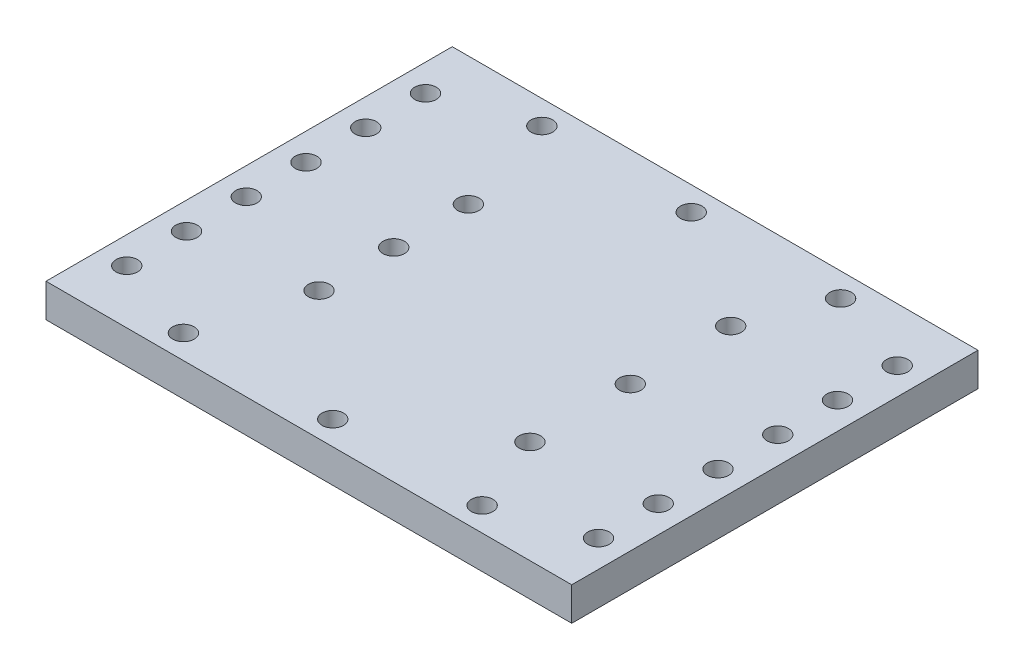
ISO-10303-21;
HEADER;
FILE_DESCRIPTION(('STEP AP214'),'2;1');
FILE_NAME('part.step','',(''),(''),'','','');
FILE_SCHEMA(('AUTOMOTIVE_DESIGN { 1 0 10303 214 1 1 1 1 }'));
ENDSEC;
DATA;
#1=APPLICATION_CONTEXT('core data for automotive mechanical design processes');
#2=APPLICATION_PROTOCOL_DEFINITION('international standard','automotive_design',2000,#1);
#3=PRODUCT_CONTEXT('',#1,'mechanical');
#4=PRODUCT('Part','Part','',(#3));
#5=PRODUCT_RELATED_PRODUCT_CATEGORY('part','',(#4));
#6=PRODUCT_DEFINITION_FORMATION('','',#4);
#7=PRODUCT_DEFINITION_CONTEXT('part definition',#1,'design');
#8=PRODUCT_DEFINITION('design','',#6,#7);
#9=PRODUCT_DEFINITION_SHAPE('','',#8);
#10=(LENGTH_UNIT() NAMED_UNIT(*) SI_UNIT(.MILLI.,.METRE.));
#11=(NAMED_UNIT(*) PLANE_ANGLE_UNIT() SI_UNIT($,.RADIAN.));
#12=(NAMED_UNIT(*) SI_UNIT($,.STERADIAN.) SOLID_ANGLE_UNIT());
#13=UNCERTAINTY_MEASURE_WITH_UNIT(LENGTH_MEASURE(1.E-05),#10,'distance_accuracy_value','');
#14=(GEOMETRIC_REPRESENTATION_CONTEXT(3) GLOBAL_UNCERTAINTY_ASSIGNED_CONTEXT((#13)) GLOBAL_UNIT_ASSIGNED_CONTEXT((#10,
#11,#12)) REPRESENTATION_CONTEXT('',''));
#15=CARTESIAN_POINT('',(0.,0.,0.));
#16=DIRECTION('',(0.,0.,1.));
#17=DIRECTION('',(1.,0.,0.));
#18=AXIS2_PLACEMENT_3D('',#15,#16,#17);
#19=CARTESIAN_POINT('',(-87.165773612082,5.588,-33.4500324441074));
#20=DIRECTION('',(1.,0.,0.));
#21=DIRECTION('',(0.,0.,-1.));
#22=AXIS2_PLACEMENT_3D('',#19,#20,#21);
#23=PLANE('',#22);
#24=DIRECTION('',(0.,0.,1.));
#25=VECTOR('',#24,1.);
#26=CARTESIAN_POINT('',(-87.165773612082,0.,-33.4500324441074));
#27=LINE('',#26,#25);
#28=CARTESIAN_POINT('',(-87.165773612082,0.,-33.4500324441074));
#29=VERTEX_POINT('',#28);
#30=CARTESIAN_POINT('',(-87.165773612082,0.,34.5499675558926));
#31=VERTEX_POINT('',#30);
#32=EDGE_CURVE('E96',#29,#31,#27,.T.);
#33=ORIENTED_EDGE('',*,*,#32,.T.);
#34=DIRECTION('',(0.,-1.,0.));
#35=VECTOR('',#34,1.);
#36=CARTESIAN_POINT('',(-87.165773612082,5.588,34.5499675558926));
#37=LINE('',#36,#35);
#38=CARTESIAN_POINT('',(-87.165773612082,5.588,34.5499675558926));
#39=VERTEX_POINT('',#38);
#40=EDGE_CURVE('E11',#39,#31,#37,.T.);
#41=ORIENTED_EDGE('',*,*,#40,.F.);
#42=DIRECTION('',(0.,0.,1.));
#43=VECTOR('',#42,1.);
#44=CARTESIAN_POINT('',(-87.165773612082,5.588,-33.4500324441074));
#45=LINE('',#44,#43);
#46=CARTESIAN_POINT('',(-87.165773612082,5.588,-33.4500324441074));
#47=VERTEX_POINT('',#46);
#48=EDGE_CURVE('E84',#47,#39,#45,.T.);
#49=ORIENTED_EDGE('',*,*,#48,.F.);
#50=DIRECTION('',(0.,-1.,0.));
#51=VECTOR('',#50,1.);
#52=CARTESIAN_POINT('',(-87.165773612082,5.588,-33.4500324441074));
#53=LINE('',#52,#51);
#54=EDGE_CURVE('E92',#47,#29,#53,.T.);
#55=ORIENTED_EDGE('',*,*,#54,.T.);
#56=EDGE_LOOP('',(#33,#41,#49,#55));
#57=FACE_BOUND('',#56,.T.);
#58=ADVANCED_FACE('F33',(#57),#23,.F.);
#59=CARTESIAN_POINT('',(-87.165773612082,5.588,34.5499675558926));
#60=DIRECTION('',(0.,0.,-1.));
#61=DIRECTION('',(-1.,0.,0.));
#62=AXIS2_PLACEMENT_3D('',#59,#60,#61);
#63=PLANE('',#62);
#64=DIRECTION('',(1.,0.,0.));
#65=VECTOR('',#64,1.);
#66=CARTESIAN_POINT('',(-87.165773612082,0.,34.5499675558926));
#67=LINE('',#66,#65);
#68=CARTESIAN_POINT('',(0.834226387917991,0.,34.5499675558926));
#69=VERTEX_POINT('',#68);
#70=EDGE_CURVE('E88',#31,#69,#67,.T.);
#71=ORIENTED_EDGE('',*,*,#70,.T.);
#72=DIRECTION('',(0.,-1.,0.));
#73=VECTOR('',#72,1.);
#74=CARTESIAN_POINT('',(0.834226387917991,5.588,34.5499675558926));
#75=LINE('',#74,#73);
#76=CARTESIAN_POINT('',(0.834226387917991,5.588,34.5499675558926));
#77=VERTEX_POINT('',#76);
#78=EDGE_CURVE('E41',#77,#69,#75,.T.);
#79=ORIENTED_EDGE('',*,*,#78,.F.);
#80=DIRECTION('',(1.,0.,0.));
#81=VECTOR('',#80,1.);
#82=CARTESIAN_POINT('',(-87.165773612082,5.588,34.5499675558926));
#83=LINE('',#82,#81);
#84=EDGE_CURVE('E79',#39,#77,#83,.T.);
#85=ORIENTED_EDGE('',*,*,#84,.F.);
#86=ORIENTED_EDGE('',*,*,#40,.T.);
#87=EDGE_LOOP('',(#71,#79,#85,#86));
#88=FACE_BOUND('',#87,.T.);
#89=ADVANCED_FACE('F87',(#88),#63,.F.);
#90=CARTESIAN_POINT('',(0.834226387917983,5.588,-33.4500324441074));
#91=DIRECTION('',(-1.,0.,0.));
#92=DIRECTION('',(0.,0.,1.));
#93=AXIS2_PLACEMENT_3D('',#90,#91,#92);
#94=PLANE('',#93);
#95=DIRECTION('',(0.,0.,-1.));
#96=VECTOR('',#95,1.);
#97=CARTESIAN_POINT('',(0.834226387917983,0.,-33.4500324441074));
#98=LINE('',#97,#96);
#99=CARTESIAN_POINT('',(0.834226387917983,0.,-33.4500324441074));
#100=VERTEX_POINT('',#99);
#101=EDGE_CURVE('E66',#69,#100,#98,.T.);
#102=ORIENTED_EDGE('',*,*,#101,.T.);
#103=DIRECTION('',(0.,-1.,0.));
#104=VECTOR('',#103,1.);
#105=CARTESIAN_POINT('',(0.834226387917983,5.588,-33.4500324441074));
#106=LINE('',#105,#104);
#107=CARTESIAN_POINT('',(0.834226387917983,5.588,-33.4500324441074));
#108=VERTEX_POINT('',#107);
#109=EDGE_CURVE('E89',#108,#100,#106,.T.);
#110=ORIENTED_EDGE('',*,*,#109,.F.);
#111=DIRECTION('',(0.,0.,-1.));
#112=VECTOR('',#111,1.);
#113=CARTESIAN_POINT('',(0.834226387917983,5.588,-33.4500324441074));
#114=LINE('',#113,#112);
#115=EDGE_CURVE('E82',#77,#108,#114,.T.);
#116=ORIENTED_EDGE('',*,*,#115,.F.);
#117=ORIENTED_EDGE('',*,*,#78,.T.);
#118=EDGE_LOOP('',(#102,#110,#116,#117));
#119=FACE_BOUND('',#118,.T.);
#120=ADVANCED_FACE('F90',(#119),#94,.F.);
#121=CARTESIAN_POINT('',(-87.165773612082,5.588,-33.4500324441074));
#122=DIRECTION('',(0.,0.,1.));
#123=DIRECTION('',(1.,0.,0.));
#124=AXIS2_PLACEMENT_3D('',#121,#122,#123);
#125=PLANE('',#124);
#126=DIRECTION('',(-1.,0.,0.));
#127=VECTOR('',#126,1.);
#128=CARTESIAN_POINT('',(-87.165773612082,0.,-33.4500324441074));
#129=LINE('',#128,#127);
#130=EDGE_CURVE('E72',#100,#29,#129,.T.);
#131=ORIENTED_EDGE('',*,*,#130,.T.);
#132=ORIENTED_EDGE('',*,*,#54,.F.);
#133=DIRECTION('',(-1.,0.,0.));
#134=VECTOR('',#133,1.);
#135=CARTESIAN_POINT('',(-87.165773612082,5.588,-33.4500324441074));
#136=LINE('',#135,#134);
#137=EDGE_CURVE('E49',#108,#47,#136,.T.);
#138=ORIENTED_EDGE('',*,*,#137,.F.);
#139=ORIENTED_EDGE('',*,*,#109,.T.);
#140=EDGE_LOOP('',(#131,#132,#138,#139));
#141=FACE_BOUND('',#140,.T.);
#142=ADVANCED_FACE('F104',(#141),#125,.F.);
#143=CARTESIAN_POINT('',(0.,5.588,0.));
#144=DIRECTION('',(0.,1.,0.));
#145=DIRECTION('',(0.,0.,1.));
#146=AXIS2_PLACEMENT_3D('',#143,#144,#145);
#147=PLANE('',#146);
#148=CARTESIAN_POINT('',(-3.68577361208203,5.588,25.5499675558926));
#149=DIRECTION('',(0.,1.,0.));
#150=DIRECTION('',(0.,0.,1.));
#151=AXIS2_PLACEMENT_3D('',#148,#149,#150);
#152=CIRCLE('',#151,1.8);
#153=CARTESIAN_POINT('',(-3.68577361208203,5.588,27.3499675558926));
#154=VERTEX_POINT('',#153);
#155=EDGE_CURVE('E248',#154,#154,#152,.T.);
#156=ORIENTED_EDGE('',*,*,#155,.F.);
#157=EDGE_LOOP('',(#156));
#158=FACE_BOUND('',#157,.T.);
#159=CARTESIAN_POINT('',(-82.645773612082,5.588,25.5499675558926));
#160=DIRECTION('',(0.,1.,0.));
#161=DIRECTION('',(0.,0.,1.));
#162=AXIS2_PLACEMENT_3D('',#159,#160,#161);
#163=CIRCLE('',#162,1.79999999999999);
#164=CARTESIAN_POINT('',(-82.645773612082,5.588,27.3499675558926));
#165=VERTEX_POINT('',#164);
#166=EDGE_CURVE('E242',#165,#165,#163,.T.);
#167=ORIENTED_EDGE('',*,*,#166,.F.);
#168=EDGE_LOOP('',(#167));
#169=FACE_BOUND('',#168,.T.);
#170=CARTESIAN_POINT('',(-3.68577361208203,5.588,15.5499675558926));
#171=DIRECTION('',(0.,1.,0.));
#172=DIRECTION('',(0.,0.,1.));
#173=AXIS2_PLACEMENT_3D('',#170,#171,#172);
#174=CIRCLE('',#173,1.8);
#175=CARTESIAN_POINT('',(-3.68577361208203,5.588,17.3499675558926));
#176=VERTEX_POINT('',#175);
#177=EDGE_CURVE('E236',#176,#176,#174,.T.);
#178=ORIENTED_EDGE('',*,*,#177,.F.);
#179=EDGE_LOOP('',(#178));
#180=FACE_BOUND('',#179,.T.);
#181=CARTESIAN_POINT('',(-82.645773612082,5.588,15.5499675558926));
#182=DIRECTION('',(0.,1.,0.));
#183=DIRECTION('',(0.,0.,1.));
#184=AXIS2_PLACEMENT_3D('',#181,#182,#183);
#185=CIRCLE('',#184,1.79999999999999);
#186=CARTESIAN_POINT('',(-82.645773612082,5.588,17.3499675558926));
#187=VERTEX_POINT('',#186);
#188=EDGE_CURVE('E230',#187,#187,#185,.T.);
#189=ORIENTED_EDGE('',*,*,#188,.F.);
#190=EDGE_LOOP('',(#189));
#191=FACE_BOUND('',#190,.T.);
#192=CARTESIAN_POINT('',(-3.68577361208203,5.588,5.54996755589264));
#193=DIRECTION('',(0.,1.,0.));
#194=DIRECTION('',(0.,0.,1.));
#195=AXIS2_PLACEMENT_3D('',#192,#193,#194);
#196=CIRCLE('',#195,1.8);
#197=CARTESIAN_POINT('',(-3.68577361208203,5.588,7.34996755589264));
#198=VERTEX_POINT('',#197);
#199=EDGE_CURVE('E224',#198,#198,#196,.T.);
#200=ORIENTED_EDGE('',*,*,#199,.F.);
#201=EDGE_LOOP('',(#200));
#202=FACE_BOUND('',#201,.T.);
#203=CARTESIAN_POINT('',(-82.645773612082,5.588,5.54996755589264));
#204=DIRECTION('',(0.,1.,0.));
#205=DIRECTION('',(0.,0.,1.));
#206=AXIS2_PLACEMENT_3D('',#203,#204,#205);
#207=CIRCLE('',#206,1.79999999999999);
#208=CARTESIAN_POINT('',(-82.645773612082,5.588,7.34996755589263));
#209=VERTEX_POINT('',#208);
#210=EDGE_CURVE('E218',#209,#209,#207,.T.);
#211=ORIENTED_EDGE('',*,*,#210,.F.);
#212=EDGE_LOOP('',(#211));
#213=FACE_BOUND('',#212,.T.);
#214=CARTESIAN_POINT('',(-3.68577361208203,5.588,-4.45003244410736));
#215=DIRECTION('',(0.,1.,0.));
#216=DIRECTION('',(0.,0.,1.));
#217=AXIS2_PLACEMENT_3D('',#214,#215,#216);
#218=CIRCLE('',#217,1.8);
#219=CARTESIAN_POINT('',(-3.68577361208203,5.588,-2.65003244410736));
#220=VERTEX_POINT('',#219);
#221=EDGE_CURVE('E212',#220,#220,#218,.T.);
#222=ORIENTED_EDGE('',*,*,#221,.F.);
#223=EDGE_LOOP('',(#222));
#224=FACE_BOUND('',#223,.T.);
#225=CARTESIAN_POINT('',(-82.645773612082,5.588,-4.45003244410736));
#226=DIRECTION('',(0.,1.,0.));
#227=DIRECTION('',(0.,0.,1.));
#228=AXIS2_PLACEMENT_3D('',#225,#226,#227);
#229=CIRCLE('',#228,1.79999999999999);
#230=CARTESIAN_POINT('',(-82.645773612082,5.588,-2.65003244410736));
#231=VERTEX_POINT('',#230);
#232=EDGE_CURVE('E206',#231,#231,#229,.T.);
#233=ORIENTED_EDGE('',*,*,#232,.F.);
#234=EDGE_LOOP('',(#233));
#235=FACE_BOUND('',#234,.T.);
#236=CARTESIAN_POINT('',(-3.68577361208202,5.588,-14.4500324441074));
#237=DIRECTION('',(0.,1.,0.));
#238=DIRECTION('',(0.,0.,1.));
#239=AXIS2_PLACEMENT_3D('',#236,#237,#238);
#240=CIRCLE('',#239,1.8);
#241=CARTESIAN_POINT('',(-3.68577361208202,5.588,-12.6500324441074));
#242=VERTEX_POINT('',#241);
#243=EDGE_CURVE('E200',#242,#242,#240,.T.);
#244=ORIENTED_EDGE('',*,*,#243,.F.);
#245=EDGE_LOOP('',(#244));
#246=FACE_BOUND('',#245,.T.);
#247=CARTESIAN_POINT('',(-82.645773612082,5.588,-14.4500324441074));
#248=DIRECTION('',(0.,1.,0.));
#249=DIRECTION('',(0.,0.,1.));
#250=AXIS2_PLACEMENT_3D('',#247,#248,#249);
#251=CIRCLE('',#250,1.79999999999999);
#252=CARTESIAN_POINT('',(-82.645773612082,5.588,-12.6500324441074));
#253=VERTEX_POINT('',#252);
#254=EDGE_CURVE('E194',#253,#253,#251,.T.);
#255=ORIENTED_EDGE('',*,*,#254,.F.);
#256=EDGE_LOOP('',(#255));
#257=FACE_BOUND('',#256,.T.);
#258=CARTESIAN_POINT('',(-3.68577361208202,5.588,-24.4500324441074));
#259=DIRECTION('',(0.,1.,0.));
#260=DIRECTION('',(0.,0.,1.));
#261=AXIS2_PLACEMENT_3D('',#258,#259,#260);
#262=CIRCLE('',#261,1.8);
#263=CARTESIAN_POINT('',(-3.68577361208202,5.588,-22.6500324441074));
#264=VERTEX_POINT('',#263);
#265=EDGE_CURVE('E188',#264,#264,#262,.T.);
#266=ORIENTED_EDGE('',*,*,#265,.F.);
#267=EDGE_LOOP('',(#266));
#268=FACE_BOUND('',#267,.T.);
#269=CARTESIAN_POINT('',(-82.645773612082,5.588,-24.4500324441074));
#270=DIRECTION('',(0.,1.,0.));
#271=DIRECTION('',(0.,0.,1.));
#272=AXIS2_PLACEMENT_3D('',#269,#270,#271);
#273=CIRCLE('',#272,1.79999999999999);
#274=CARTESIAN_POINT('',(-82.645773612082,5.588,-22.6500324441074));
#275=VERTEX_POINT('',#274);
#276=EDGE_CURVE('E182',#275,#275,#273,.T.);
#277=ORIENTED_EDGE('',*,*,#276,.F.);
#278=EDGE_LOOP('',(#277));
#279=FACE_BOUND('',#278,.T.);
#280=CARTESIAN_POINT('',(-62.965773612082,5.588,-11.9500324441074));
#281=DIRECTION('',(0.,1.,0.));
#282=DIRECTION('',(0.,0.,1.));
#283=AXIS2_PLACEMENT_3D('',#280,#281,#282);
#284=CIRCLE('',#283,1.8);
#285=CARTESIAN_POINT('',(-62.965773612082,5.588,-10.1500324441073));
#286=VERTEX_POINT('',#285);
#287=EDGE_CURVE('E176',#286,#286,#284,.T.);
#288=ORIENTED_EDGE('',*,*,#287,.F.);
#289=EDGE_LOOP('',(#288));
#290=FACE_BOUND('',#289,.T.);
#291=CARTESIAN_POINT('',(-62.965773612082,5.588,13.0499675558926));
#292=DIRECTION('',(0.,1.,0.));
#293=DIRECTION('',(0.,0.,1.));
#294=AXIS2_PLACEMENT_3D('',#291,#292,#293);
#295=CIRCLE('',#294,1.8);
#296=CARTESIAN_POINT('',(-62.965773612082,5.588,14.8499675558927));
#297=VERTEX_POINT('',#296);
#298=EDGE_CURVE('E170',#297,#297,#295,.T.);
#299=ORIENTED_EDGE('',*,*,#298,.F.);
#300=EDGE_LOOP('',(#299));
#301=FACE_BOUND('',#300,.T.);
#302=CARTESIAN_POINT('',(-23.365773612082,5.588,-16.2500324441074));
#303=DIRECTION('',(0.,1.,0.));
#304=DIRECTION('',(0.,0.,1.));
#305=AXIS2_PLACEMENT_3D('',#302,#303,#304);
#306=CIRCLE('',#305,1.8);
#307=CARTESIAN_POINT('',(-23.365773612082,5.588,-14.4500324441074));
#308=VERTEX_POINT('',#307);
#309=EDGE_CURVE('E164',#308,#308,#306,.T.);
#310=ORIENTED_EDGE('',*,*,#309,.F.);
#311=EDGE_LOOP('',(#310));
#312=FACE_BOUND('',#311,.T.);
#313=CARTESIAN_POINT('',(-23.365773612082,5.588,17.3499675558927));
#314=DIRECTION('',(0.,1.,0.));
#315=DIRECTION('',(0.,0.,1.));
#316=AXIS2_PLACEMENT_3D('',#313,#314,#315);
#317=CIRCLE('',#316,1.8);
#318=CARTESIAN_POINT('',(-23.365773612082,5.588,19.1499675558927));
#319=VERTEX_POINT('',#318);
#320=EDGE_CURVE('E158',#319,#319,#317,.T.);
#321=ORIENTED_EDGE('',*,*,#320,.F.);
#322=EDGE_LOOP('',(#321));
#323=FACE_BOUND('',#322,.T.);
#324=CARTESIAN_POINT('',(-23.365773612082,5.588,0.54996755589265));
#325=DIRECTION('',(0.,1.,0.));
#326=DIRECTION('',(0.,0.,1.));
#327=AXIS2_PLACEMENT_3D('',#324,#325,#326);
#328=CIRCLE('',#327,1.8);
#329=CARTESIAN_POINT('',(-23.365773612082,5.588,2.34996755589265));
#330=VERTEX_POINT('',#329);
#331=EDGE_CURVE('E152',#330,#330,#328,.T.);
#332=ORIENTED_EDGE('',*,*,#331,.F.);
#333=EDGE_LOOP('',(#332));
#334=FACE_BOUND('',#333,.T.);
#335=CARTESIAN_POINT('',(-62.965773612082,5.588,0.54996755589265));
#336=DIRECTION('',(0.,1.,0.));
#337=DIRECTION('',(0.,0.,1.));
#338=AXIS2_PLACEMENT_3D('',#335,#336,#337);
#339=CIRCLE('',#338,1.8);
#340=CARTESIAN_POINT('',(-62.965773612082,5.588,2.34996755589265));
#341=VERTEX_POINT('',#340);
#342=EDGE_CURVE('E146',#341,#341,#339,.T.);
#343=ORIENTED_EDGE('',*,*,#342,.F.);
#344=EDGE_LOOP('',(#343));
#345=FACE_BOUND('',#344,.T.);
#346=CARTESIAN_POINT('',(-18.165773612082,5.588,30.5499675558926));
#347=DIRECTION('',(0.,1.,0.));
#348=DIRECTION('',(0.,0.,1.));
#349=AXIS2_PLACEMENT_3D('',#346,#347,#348);
#350=CIRCLE('',#349,1.8);
#351=CARTESIAN_POINT('',(-18.165773612082,5.588,32.3499675558927));
#352=VERTEX_POINT('',#351);
#353=EDGE_CURVE('E140',#352,#352,#350,.T.);
#354=ORIENTED_EDGE('',*,*,#353,.F.);
#355=EDGE_LOOP('',(#354));
#356=FACE_BOUND('',#355,.T.);
#357=CARTESIAN_POINT('',(-68.165773612082,5.588,30.5499675558926));
#358=DIRECTION('',(0.,1.,0.));
#359=DIRECTION('',(0.,0.,1.));
#360=AXIS2_PLACEMENT_3D('',#357,#358,#359);
#361=CIRCLE('',#360,1.79999999999999);
#362=CARTESIAN_POINT('',(-68.165773612082,5.588,32.3499675558926));
#363=VERTEX_POINT('',#362);
#364=EDGE_CURVE('E134',#363,#363,#361,.T.);
#365=ORIENTED_EDGE('',*,*,#364,.F.);
#366=EDGE_LOOP('',(#365));
#367=FACE_BOUND('',#366,.T.);
#368=CARTESIAN_POINT('',(-43.165773612082,5.588,30.5499675558926));
#369=DIRECTION('',(0.,1.,0.));
#370=DIRECTION('',(0.,0.,1.));
#371=AXIS2_PLACEMENT_3D('',#368,#369,#370);
#372=CIRCLE('',#371,1.8);
#373=CARTESIAN_POINT('',(-43.165773612082,5.588,32.3499675558926));
#374=VERTEX_POINT('',#373);
#375=EDGE_CURVE('E128',#374,#374,#372,.T.);
#376=ORIENTED_EDGE('',*,*,#375,.F.);
#377=EDGE_LOOP('',(#376));
#378=FACE_BOUND('',#377,.T.);
#379=CARTESIAN_POINT('',(-18.165773612082,5.588,-29.4500324441074));
#380=DIRECTION('',(0.,1.,0.));
#381=DIRECTION('',(0.,0.,1.));
#382=AXIS2_PLACEMENT_3D('',#379,#380,#381);
#383=CIRCLE('',#382,1.8);
#384=CARTESIAN_POINT('',(-18.165773612082,5.588,-27.6500324441073));
#385=VERTEX_POINT('',#384);
#386=EDGE_CURVE('E122',#385,#385,#383,.T.);
#387=ORIENTED_EDGE('',*,*,#386,.F.);
#388=EDGE_LOOP('',(#387));
#389=FACE_BOUND('',#388,.T.);
#390=CARTESIAN_POINT('',(-43.165773612082,5.588,-29.4500324441073));
#391=DIRECTION('',(0.,1.,0.));
#392=DIRECTION('',(0.,0.,1.));
#393=AXIS2_PLACEMENT_3D('',#390,#391,#392);
#394=CIRCLE('',#393,1.8);
#395=CARTESIAN_POINT('',(-43.165773612082,5.588,-27.6500324441073));
#396=VERTEX_POINT('',#395);
#397=EDGE_CURVE('E116',#396,#396,#394,.T.);
#398=ORIENTED_EDGE('',*,*,#397,.F.);
#399=EDGE_LOOP('',(#398));
#400=FACE_BOUND('',#399,.T.);
#401=CARTESIAN_POINT('',(-68.165773612082,5.588,-29.4500324441073));
#402=DIRECTION('',(0.,1.,0.));
#403=DIRECTION('',(0.,0.,1.));
#404=AXIS2_PLACEMENT_3D('',#401,#402,#403);
#405=CIRCLE('',#404,1.79999999999999);
#406=CARTESIAN_POINT('',(-68.165773612082,5.588,-27.6500324441073));
#407=VERTEX_POINT('',#406);
#408=EDGE_CURVE('E110',#407,#407,#405,.T.);
#409=ORIENTED_EDGE('',*,*,#408,.F.);
#410=EDGE_LOOP('',(#409));
#411=FACE_BOUND('',#410,.T.);
#412=ORIENTED_EDGE('',*,*,#48,.T.);
#413=ORIENTED_EDGE('',*,*,#84,.T.);
#414=ORIENTED_EDGE('',*,*,#115,.T.);
#415=ORIENTED_EDGE('',*,*,#137,.T.);
#416=EDGE_LOOP('',(#412,#413,#414,#415));
#417=FACE_BOUND('',#416,.T.);
#418=ADVANCED_FACE('F80',(#158,#169,#180,#191,#202,#213,#224,#235,#246,#257,#268,#279,#290,#301,
#312,#323,#334,#345,#356,#367,#378,#389,#400,#411,#417),#147,.T.);
#419=CARTESIAN_POINT('',(0.,0.,0.));
#420=DIRECTION('',(0.,1.,0.));
#421=DIRECTION('',(0.,0.,1.));
#422=AXIS2_PLACEMENT_3D('',#419,#420,#421);
#423=PLANE('',#422);
#424=CARTESIAN_POINT('',(-3.68577361208203,0.,25.5499675558926));
#425=DIRECTION('',(0.,1.,0.));
#426=DIRECTION('',(0.,0.,1.));
#427=AXIS2_PLACEMENT_3D('',#424,#425,#426);
#428=CIRCLE('',#427,1.8);
#429=CARTESIAN_POINT('',(-3.68577361208203,0.,27.3499675558926));
#430=VERTEX_POINT('',#429);
#431=EDGE_CURVE('E245',#430,#430,#428,.T.);
#432=ORIENTED_EDGE('',*,*,#431,.T.);
#433=EDGE_LOOP('',(#432));
#434=FACE_BOUND('',#433,.T.);
#435=CARTESIAN_POINT('',(-82.645773612082,0.,25.5499675558926));
#436=DIRECTION('',(0.,1.,0.));
#437=DIRECTION('',(0.,0.,1.));
#438=AXIS2_PLACEMENT_3D('',#435,#436,#437);
#439=CIRCLE('',#438,1.79999999999999);
#440=CARTESIAN_POINT('',(-82.645773612082,0.,27.3499675558926));
#441=VERTEX_POINT('',#440);
#442=EDGE_CURVE('E239',#441,#441,#439,.T.);
#443=ORIENTED_EDGE('',*,*,#442,.T.);
#444=EDGE_LOOP('',(#443));
#445=FACE_BOUND('',#444,.T.);
#446=CARTESIAN_POINT('',(-3.68577361208203,0.,15.5499675558926));
#447=DIRECTION('',(0.,1.,0.));
#448=DIRECTION('',(0.,0.,1.));
#449=AXIS2_PLACEMENT_3D('',#446,#447,#448);
#450=CIRCLE('',#449,1.8);
#451=CARTESIAN_POINT('',(-3.68577361208203,0.,17.3499675558926));
#452=VERTEX_POINT('',#451);
#453=EDGE_CURVE('E233',#452,#452,#450,.T.);
#454=ORIENTED_EDGE('',*,*,#453,.T.);
#455=EDGE_LOOP('',(#454));
#456=FACE_BOUND('',#455,.T.);
#457=CARTESIAN_POINT('',(-82.645773612082,0.,15.5499675558926));
#458=DIRECTION('',(0.,1.,0.));
#459=DIRECTION('',(0.,0.,1.));
#460=AXIS2_PLACEMENT_3D('',#457,#458,#459);
#461=CIRCLE('',#460,1.79999999999999);
#462=CARTESIAN_POINT('',(-82.645773612082,0.,17.3499675558926));
#463=VERTEX_POINT('',#462);
#464=EDGE_CURVE('E227',#463,#463,#461,.T.);
#465=ORIENTED_EDGE('',*,*,#464,.T.);
#466=EDGE_LOOP('',(#465));
#467=FACE_BOUND('',#466,.T.);
#468=CARTESIAN_POINT('',(-3.68577361208203,0.,5.54996755589264));
#469=DIRECTION('',(0.,1.,0.));
#470=DIRECTION('',(0.,0.,1.));
#471=AXIS2_PLACEMENT_3D('',#468,#469,#470);
#472=CIRCLE('',#471,1.8);
#473=CARTESIAN_POINT('',(-3.68577361208203,0.,7.34996755589264));
#474=VERTEX_POINT('',#473);
#475=EDGE_CURVE('E221',#474,#474,#472,.T.);
#476=ORIENTED_EDGE('',*,*,#475,.T.);
#477=EDGE_LOOP('',(#476));
#478=FACE_BOUND('',#477,.T.);
#479=CARTESIAN_POINT('',(-82.645773612082,0.,5.54996755589264));
#480=DIRECTION('',(0.,1.,0.));
#481=DIRECTION('',(0.,0.,1.));
#482=AXIS2_PLACEMENT_3D('',#479,#480,#481);
#483=CIRCLE('',#482,1.79999999999999);
#484=CARTESIAN_POINT('',(-82.645773612082,0.,7.34996755589263));
#485=VERTEX_POINT('',#484);
#486=EDGE_CURVE('E215',#485,#485,#483,.T.);
#487=ORIENTED_EDGE('',*,*,#486,.T.);
#488=EDGE_LOOP('',(#487));
#489=FACE_BOUND('',#488,.T.);
#490=CARTESIAN_POINT('',(-3.68577361208203,0.,-4.45003244410736));
#491=DIRECTION('',(0.,1.,0.));
#492=DIRECTION('',(0.,0.,1.));
#493=AXIS2_PLACEMENT_3D('',#490,#491,#492);
#494=CIRCLE('',#493,1.8);
#495=CARTESIAN_POINT('',(-3.68577361208203,0.,-2.65003244410736));
#496=VERTEX_POINT('',#495);
#497=EDGE_CURVE('E209',#496,#496,#494,.T.);
#498=ORIENTED_EDGE('',*,*,#497,.T.);
#499=EDGE_LOOP('',(#498));
#500=FACE_BOUND('',#499,.T.);
#501=CARTESIAN_POINT('',(-82.645773612082,0.,-4.45003244410736));
#502=DIRECTION('',(0.,1.,0.));
#503=DIRECTION('',(0.,0.,1.));
#504=AXIS2_PLACEMENT_3D('',#501,#502,#503);
#505=CIRCLE('',#504,1.79999999999999);
#506=CARTESIAN_POINT('',(-82.645773612082,0.,-2.65003244410736));
#507=VERTEX_POINT('',#506);
#508=EDGE_CURVE('E203',#507,#507,#505,.T.);
#509=ORIENTED_EDGE('',*,*,#508,.T.);
#510=EDGE_LOOP('',(#509));
#511=FACE_BOUND('',#510,.T.);
#512=CARTESIAN_POINT('',(-3.68577361208202,0.,-14.4500324441074));
#513=DIRECTION('',(0.,1.,0.));
#514=DIRECTION('',(0.,0.,1.));
#515=AXIS2_PLACEMENT_3D('',#512,#513,#514);
#516=CIRCLE('',#515,1.8);
#517=CARTESIAN_POINT('',(-3.68577361208202,0.,-12.6500324441074));
#518=VERTEX_POINT('',#517);
#519=EDGE_CURVE('E197',#518,#518,#516,.T.);
#520=ORIENTED_EDGE('',*,*,#519,.T.);
#521=EDGE_LOOP('',(#520));
#522=FACE_BOUND('',#521,.T.);
#523=CARTESIAN_POINT('',(-82.645773612082,0.,-14.4500324441074));
#524=DIRECTION('',(0.,1.,0.));
#525=DIRECTION('',(0.,0.,1.));
#526=AXIS2_PLACEMENT_3D('',#523,#524,#525);
#527=CIRCLE('',#526,1.79999999999999);
#528=CARTESIAN_POINT('',(-82.645773612082,0.,-12.6500324441074));
#529=VERTEX_POINT('',#528);
#530=EDGE_CURVE('E191',#529,#529,#527,.T.);
#531=ORIENTED_EDGE('',*,*,#530,.T.);
#532=EDGE_LOOP('',(#531));
#533=FACE_BOUND('',#532,.T.);
#534=CARTESIAN_POINT('',(-3.68577361208202,0.,-24.4500324441074));
#535=DIRECTION('',(0.,1.,0.));
#536=DIRECTION('',(0.,0.,1.));
#537=AXIS2_PLACEMENT_3D('',#534,#535,#536);
#538=CIRCLE('',#537,1.8);
#539=CARTESIAN_POINT('',(-3.68577361208202,0.,-22.6500324441074));
#540=VERTEX_POINT('',#539);
#541=EDGE_CURVE('E185',#540,#540,#538,.T.);
#542=ORIENTED_EDGE('',*,*,#541,.T.);
#543=EDGE_LOOP('',(#542));
#544=FACE_BOUND('',#543,.T.);
#545=CARTESIAN_POINT('',(-82.645773612082,0.,-24.4500324441074));
#546=DIRECTION('',(0.,1.,0.));
#547=DIRECTION('',(0.,0.,1.));
#548=AXIS2_PLACEMENT_3D('',#545,#546,#547);
#549=CIRCLE('',#548,1.79999999999999);
#550=CARTESIAN_POINT('',(-82.645773612082,0.,-22.6500324441074));
#551=VERTEX_POINT('',#550);
#552=EDGE_CURVE('E179',#551,#551,#549,.T.);
#553=ORIENTED_EDGE('',*,*,#552,.T.);
#554=EDGE_LOOP('',(#553));
#555=FACE_BOUND('',#554,.T.);
#556=CARTESIAN_POINT('',(-62.965773612082,0.,-11.9500324441074));
#557=DIRECTION('',(0.,1.,0.));
#558=DIRECTION('',(0.,0.,1.));
#559=AXIS2_PLACEMENT_3D('',#556,#557,#558);
#560=CIRCLE('',#559,1.8);
#561=CARTESIAN_POINT('',(-62.965773612082,0.,-10.1500324441073));
#562=VERTEX_POINT('',#561);
#563=EDGE_CURVE('E173',#562,#562,#560,.T.);
#564=ORIENTED_EDGE('',*,*,#563,.T.);
#565=EDGE_LOOP('',(#564));
#566=FACE_BOUND('',#565,.T.);
#567=CARTESIAN_POINT('',(-62.965773612082,0.,13.0499675558926));
#568=DIRECTION('',(0.,1.,0.));
#569=DIRECTION('',(0.,0.,1.));
#570=AXIS2_PLACEMENT_3D('',#567,#568,#569);
#571=CIRCLE('',#570,1.8);
#572=CARTESIAN_POINT('',(-62.965773612082,0.,14.8499675558927));
#573=VERTEX_POINT('',#572);
#574=EDGE_CURVE('E167',#573,#573,#571,.T.);
#575=ORIENTED_EDGE('',*,*,#574,.T.);
#576=EDGE_LOOP('',(#575));
#577=FACE_BOUND('',#576,.T.);
#578=CARTESIAN_POINT('',(-23.365773612082,0.,-16.2500324441074));
#579=DIRECTION('',(0.,1.,0.));
#580=DIRECTION('',(0.,0.,1.));
#581=AXIS2_PLACEMENT_3D('',#578,#579,#580);
#582=CIRCLE('',#581,1.8);
#583=CARTESIAN_POINT('',(-23.365773612082,0.,-14.4500324441074));
#584=VERTEX_POINT('',#583);
#585=EDGE_CURVE('E161',#584,#584,#582,.T.);
#586=ORIENTED_EDGE('',*,*,#585,.T.);
#587=EDGE_LOOP('',(#586));
#588=FACE_BOUND('',#587,.T.);
#589=CARTESIAN_POINT('',(-23.365773612082,0.,17.3499675558927));
#590=DIRECTION('',(0.,1.,0.));
#591=DIRECTION('',(0.,0.,1.));
#592=AXIS2_PLACEMENT_3D('',#589,#590,#591);
#593=CIRCLE('',#592,1.8);
#594=CARTESIAN_POINT('',(-23.365773612082,0.,19.1499675558927));
#595=VERTEX_POINT('',#594);
#596=EDGE_CURVE('E155',#595,#595,#593,.T.);
#597=ORIENTED_EDGE('',*,*,#596,.T.);
#598=EDGE_LOOP('',(#597));
#599=FACE_BOUND('',#598,.T.);
#600=CARTESIAN_POINT('',(-23.365773612082,0.,0.54996755589265));
#601=DIRECTION('',(0.,1.,0.));
#602=DIRECTION('',(0.,0.,1.));
#603=AXIS2_PLACEMENT_3D('',#600,#601,#602);
#604=CIRCLE('',#603,1.8);
#605=CARTESIAN_POINT('',(-23.365773612082,0.,2.34996755589265));
#606=VERTEX_POINT('',#605);
#607=EDGE_CURVE('E149',#606,#606,#604,.T.);
#608=ORIENTED_EDGE('',*,*,#607,.T.);
#609=EDGE_LOOP('',(#608));
#610=FACE_BOUND('',#609,.T.);
#611=CARTESIAN_POINT('',(-62.965773612082,0.,0.54996755589265));
#612=DIRECTION('',(0.,1.,0.));
#613=DIRECTION('',(0.,0.,1.));
#614=AXIS2_PLACEMENT_3D('',#611,#612,#613);
#615=CIRCLE('',#614,1.8);
#616=CARTESIAN_POINT('',(-62.965773612082,0.,2.34996755589265));
#617=VERTEX_POINT('',#616);
#618=EDGE_CURVE('E143',#617,#617,#615,.T.);
#619=ORIENTED_EDGE('',*,*,#618,.T.);
#620=EDGE_LOOP('',(#619));
#621=FACE_BOUND('',#620,.T.);
#622=CARTESIAN_POINT('',(-18.165773612082,0.,30.5499675558926));
#623=DIRECTION('',(0.,1.,0.));
#624=DIRECTION('',(0.,0.,1.));
#625=AXIS2_PLACEMENT_3D('',#622,#623,#624);
#626=CIRCLE('',#625,1.8);
#627=CARTESIAN_POINT('',(-18.165773612082,0.,32.3499675558927));
#628=VERTEX_POINT('',#627);
#629=EDGE_CURVE('E137',#628,#628,#626,.T.);
#630=ORIENTED_EDGE('',*,*,#629,.T.);
#631=EDGE_LOOP('',(#630));
#632=FACE_BOUND('',#631,.T.);
#633=CARTESIAN_POINT('',(-68.165773612082,0.,30.5499675558926));
#634=DIRECTION('',(0.,1.,0.));
#635=DIRECTION('',(0.,0.,1.));
#636=AXIS2_PLACEMENT_3D('',#633,#634,#635);
#637=CIRCLE('',#636,1.79999999999999);
#638=CARTESIAN_POINT('',(-68.165773612082,0.,32.3499675558926));
#639=VERTEX_POINT('',#638);
#640=EDGE_CURVE('E131',#639,#639,#637,.T.);
#641=ORIENTED_EDGE('',*,*,#640,.T.);
#642=EDGE_LOOP('',(#641));
#643=FACE_BOUND('',#642,.T.);
#644=CARTESIAN_POINT('',(-43.165773612082,0.,30.5499675558926));
#645=DIRECTION('',(0.,1.,0.));
#646=DIRECTION('',(0.,0.,1.));
#647=AXIS2_PLACEMENT_3D('',#644,#645,#646);
#648=CIRCLE('',#647,1.8);
#649=CARTESIAN_POINT('',(-43.165773612082,0.,32.3499675558926));
#650=VERTEX_POINT('',#649);
#651=EDGE_CURVE('E125',#650,#650,#648,.T.);
#652=ORIENTED_EDGE('',*,*,#651,.T.);
#653=EDGE_LOOP('',(#652));
#654=FACE_BOUND('',#653,.T.);
#655=CARTESIAN_POINT('',(-18.165773612082,0.,-29.4500324441074));
#656=DIRECTION('',(0.,1.,0.));
#657=DIRECTION('',(0.,0.,1.));
#658=AXIS2_PLACEMENT_3D('',#655,#656,#657);
#659=CIRCLE('',#658,1.8);
#660=CARTESIAN_POINT('',(-18.165773612082,0.,-27.6500324441073));
#661=VERTEX_POINT('',#660);
#662=EDGE_CURVE('E119',#661,#661,#659,.T.);
#663=ORIENTED_EDGE('',*,*,#662,.T.);
#664=EDGE_LOOP('',(#663));
#665=FACE_BOUND('',#664,.T.);
#666=CARTESIAN_POINT('',(-43.165773612082,0.,-29.4500324441073));
#667=DIRECTION('',(0.,1.,0.));
#668=DIRECTION('',(0.,0.,1.));
#669=AXIS2_PLACEMENT_3D('',#666,#667,#668);
#670=CIRCLE('',#669,1.8);
#671=CARTESIAN_POINT('',(-43.165773612082,0.,-27.6500324441073));
#672=VERTEX_POINT('',#671);
#673=EDGE_CURVE('E113',#672,#672,#670,.T.);
#674=ORIENTED_EDGE('',*,*,#673,.T.);
#675=EDGE_LOOP('',(#674));
#676=FACE_BOUND('',#675,.T.);
#677=CARTESIAN_POINT('',(-68.165773612082,0.,-29.4500324441073));
#678=DIRECTION('',(0.,1.,0.));
#679=DIRECTION('',(0.,0.,1.));
#680=AXIS2_PLACEMENT_3D('',#677,#678,#679);
#681=CIRCLE('',#680,1.79999999999999);
#682=CARTESIAN_POINT('',(-68.165773612082,0.,-27.6500324441073));
#683=VERTEX_POINT('',#682);
#684=EDGE_CURVE('E99',#683,#683,#681,.T.);
#685=ORIENTED_EDGE('',*,*,#684,.T.);
#686=EDGE_LOOP('',(#685));
#687=FACE_BOUND('',#686,.T.);
#688=ORIENTED_EDGE('',*,*,#32,.F.);
#689=ORIENTED_EDGE('',*,*,#130,.F.);
#690=ORIENTED_EDGE('',*,*,#101,.F.);
#691=ORIENTED_EDGE('',*,*,#70,.F.);
#692=EDGE_LOOP('',(#688,#689,#690,#691));
#693=FACE_BOUND('',#692,.T.);
#694=ADVANCED_FACE('F107',(#434,#445,#456,#467,#478,#489,#500,#511,#522,#533,#544,#555,#566,
#577,#588,#599,#610,#621,#632,#643,#654,#665,#676,#687,#693),#423,.F.);
#695=CARTESIAN_POINT('',(-68.165773612082,0.,-29.4500324441073));
#696=DIRECTION('',(0.,1.,0.));
#697=DIRECTION('',(0.,0.,1.));
#698=AXIS2_PLACEMENT_3D('',#695,#696,#697);
#699=CYLINDRICAL_SURFACE('',#698,1.79999999999999);
#700=ORIENTED_EDGE('',*,*,#684,.F.);
#701=EDGE_LOOP('',(#700));
#702=FACE_BOUND('',#701,.T.);
#703=ORIENTED_EDGE('',*,*,#408,.T.);
#704=EDGE_LOOP('',(#703));
#705=FACE_BOUND('',#704,.T.);
#706=ADVANCED_FACE('F312',(#702,#705),#699,.F.);
#707=CARTESIAN_POINT('',(-43.165773612082,0.,-29.4500324441073));
#708=DIRECTION('',(0.,1.,0.));
#709=DIRECTION('',(0.,0.,1.));
#710=AXIS2_PLACEMENT_3D('',#707,#708,#709);
#711=CYLINDRICAL_SURFACE('',#710,1.8);
#712=ORIENTED_EDGE('',*,*,#673,.F.);
#713=EDGE_LOOP('',(#712));
#714=FACE_BOUND('',#713,.T.);
#715=ORIENTED_EDGE('',*,*,#397,.T.);
#716=EDGE_LOOP('',(#715));
#717=FACE_BOUND('',#716,.T.);
#718=ADVANCED_FACE('F314',(#714,#717),#711,.F.);
#719=CARTESIAN_POINT('',(-18.165773612082,0.,-29.4500324441074));
#720=DIRECTION('',(0.,1.,0.));
#721=DIRECTION('',(0.,0.,1.));
#722=AXIS2_PLACEMENT_3D('',#719,#720,#721);
#723=CYLINDRICAL_SURFACE('',#722,1.8);
#724=ORIENTED_EDGE('',*,*,#662,.F.);
#725=EDGE_LOOP('',(#724));
#726=FACE_BOUND('',#725,.T.);
#727=ORIENTED_EDGE('',*,*,#386,.T.);
#728=EDGE_LOOP('',(#727));
#729=FACE_BOUND('',#728,.T.);
#730=ADVANCED_FACE('F321',(#726,#729),#723,.F.);
#731=CARTESIAN_POINT('',(-43.165773612082,0.,30.5499675558926));
#732=DIRECTION('',(0.,1.,0.));
#733=DIRECTION('',(0.,0.,1.));
#734=AXIS2_PLACEMENT_3D('',#731,#732,#733);
#735=CYLINDRICAL_SURFACE('',#734,1.8);
#736=ORIENTED_EDGE('',*,*,#651,.F.);
#737=EDGE_LOOP('',(#736));
#738=FACE_BOUND('',#737,.T.);
#739=ORIENTED_EDGE('',*,*,#375,.T.);
#740=EDGE_LOOP('',(#739));
#741=FACE_BOUND('',#740,.T.);
#742=ADVANCED_FACE('F367',(#738,#741),#735,.F.);
#743=CARTESIAN_POINT('',(-68.165773612082,0.,30.5499675558926));
#744=DIRECTION('',(0.,1.,0.));
#745=DIRECTION('',(0.,0.,1.));
#746=AXIS2_PLACEMENT_3D('',#743,#744,#745);
#747=CYLINDRICAL_SURFACE('',#746,1.79999999999999);
#748=ORIENTED_EDGE('',*,*,#640,.F.);
#749=EDGE_LOOP('',(#748));
#750=FACE_BOUND('',#749,.T.);
#751=ORIENTED_EDGE('',*,*,#364,.T.);
#752=EDGE_LOOP('',(#751));
#753=FACE_BOUND('',#752,.T.);
#754=ADVANCED_FACE('F377',(#750,#753),#747,.F.);
#755=CARTESIAN_POINT('',(-18.165773612082,0.,30.5499675558926));
#756=DIRECTION('',(0.,1.,0.));
#757=DIRECTION('',(0.,0.,1.));
#758=AXIS2_PLACEMENT_3D('',#755,#756,#757);
#759=CYLINDRICAL_SURFACE('',#758,1.8);
#760=ORIENTED_EDGE('',*,*,#629,.F.);
#761=EDGE_LOOP('',(#760));
#762=FACE_BOUND('',#761,.T.);
#763=ORIENTED_EDGE('',*,*,#353,.T.);
#764=EDGE_LOOP('',(#763));
#765=FACE_BOUND('',#764,.T.);
#766=ADVANCED_FACE('F387',(#762,#765),#759,.F.);
#767=CARTESIAN_POINT('',(-62.965773612082,0.,0.54996755589265));
#768=DIRECTION('',(0.,1.,0.));
#769=DIRECTION('',(0.,0.,1.));
#770=AXIS2_PLACEMENT_3D('',#767,#768,#769);
#771=CYLINDRICAL_SURFACE('',#770,1.8);
#772=ORIENTED_EDGE('',*,*,#618,.F.);
#773=EDGE_LOOP('',(#772));
#774=FACE_BOUND('',#773,.T.);
#775=ORIENTED_EDGE('',*,*,#342,.T.);
#776=EDGE_LOOP('',(#775));
#777=FACE_BOUND('',#776,.T.);
#778=ADVANCED_FACE('F397',(#774,#777),#771,.F.);
#779=CARTESIAN_POINT('',(-23.365773612082,0.,0.54996755589265));
#780=DIRECTION('',(0.,1.,0.));
#781=DIRECTION('',(0.,0.,1.));
#782=AXIS2_PLACEMENT_3D('',#779,#780,#781);
#783=CYLINDRICAL_SURFACE('',#782,1.8);
#784=ORIENTED_EDGE('',*,*,#607,.F.);
#785=EDGE_LOOP('',(#784));
#786=FACE_BOUND('',#785,.T.);
#787=ORIENTED_EDGE('',*,*,#331,.T.);
#788=EDGE_LOOP('',(#787));
#789=FACE_BOUND('',#788,.T.);
#790=ADVANCED_FACE('F407',(#786,#789),#783,.F.);
#791=CARTESIAN_POINT('',(-23.365773612082,0.,17.3499675558927));
#792=DIRECTION('',(0.,1.,0.));
#793=DIRECTION('',(0.,0.,1.));
#794=AXIS2_PLACEMENT_3D('',#791,#792,#793);
#795=CYLINDRICAL_SURFACE('',#794,1.8);
#796=ORIENTED_EDGE('',*,*,#596,.F.);
#797=EDGE_LOOP('',(#796));
#798=FACE_BOUND('',#797,.T.);
#799=ORIENTED_EDGE('',*,*,#320,.T.);
#800=EDGE_LOOP('',(#799));
#801=FACE_BOUND('',#800,.T.);
#802=ADVANCED_FACE('F417',(#798,#801),#795,.F.);
#803=CARTESIAN_POINT('',(-23.365773612082,0.,-16.2500324441074));
#804=DIRECTION('',(0.,1.,0.));
#805=DIRECTION('',(0.,0.,1.));
#806=AXIS2_PLACEMENT_3D('',#803,#804,#805);
#807=CYLINDRICAL_SURFACE('',#806,1.8);
#808=ORIENTED_EDGE('',*,*,#585,.F.);
#809=EDGE_LOOP('',(#808));
#810=FACE_BOUND('',#809,.T.);
#811=ORIENTED_EDGE('',*,*,#309,.T.);
#812=EDGE_LOOP('',(#811));
#813=FACE_BOUND('',#812,.T.);
#814=ADVANCED_FACE('F427',(#810,#813),#807,.F.);
#815=CARTESIAN_POINT('',(-62.965773612082,0.,13.0499675558926));
#816=DIRECTION('',(0.,1.,0.));
#817=DIRECTION('',(0.,0.,1.));
#818=AXIS2_PLACEMENT_3D('',#815,#816,#817);
#819=CYLINDRICAL_SURFACE('',#818,1.8);
#820=ORIENTED_EDGE('',*,*,#574,.F.);
#821=EDGE_LOOP('',(#820));
#822=FACE_BOUND('',#821,.T.);
#823=ORIENTED_EDGE('',*,*,#298,.T.);
#824=EDGE_LOOP('',(#823));
#825=FACE_BOUND('',#824,.T.);
#826=ADVANCED_FACE('F437',(#822,#825),#819,.F.);
#827=CARTESIAN_POINT('',(-62.965773612082,0.,-11.9500324441074));
#828=DIRECTION('',(0.,1.,0.));
#829=DIRECTION('',(0.,0.,1.));
#830=AXIS2_PLACEMENT_3D('',#827,#828,#829);
#831=CYLINDRICAL_SURFACE('',#830,1.8);
#832=ORIENTED_EDGE('',*,*,#563,.F.);
#833=EDGE_LOOP('',(#832));
#834=FACE_BOUND('',#833,.T.);
#835=ORIENTED_EDGE('',*,*,#287,.T.);
#836=EDGE_LOOP('',(#835));
#837=FACE_BOUND('',#836,.T.);
#838=ADVANCED_FACE('F447',(#834,#837),#831,.F.);
#839=CARTESIAN_POINT('',(-82.645773612082,0.,-24.4500324441074));
#840=DIRECTION('',(0.,1.,0.));
#841=DIRECTION('',(0.,0.,1.));
#842=AXIS2_PLACEMENT_3D('',#839,#840,#841);
#843=CYLINDRICAL_SURFACE('',#842,1.79999999999999);
#844=ORIENTED_EDGE('',*,*,#552,.F.);
#845=EDGE_LOOP('',(#844));
#846=FACE_BOUND('',#845,.T.);
#847=ORIENTED_EDGE('',*,*,#276,.T.);
#848=EDGE_LOOP('',(#847));
#849=FACE_BOUND('',#848,.T.);
#850=ADVANCED_FACE('F457',(#846,#849),#843,.F.);
#851=CARTESIAN_POINT('',(-3.68577361208202,0.,-24.4500324441074));
#852=DIRECTION('',(0.,1.,0.));
#853=DIRECTION('',(0.,0.,1.));
#854=AXIS2_PLACEMENT_3D('',#851,#852,#853);
#855=CYLINDRICAL_SURFACE('',#854,1.8);
#856=ORIENTED_EDGE('',*,*,#541,.F.);
#857=EDGE_LOOP('',(#856));
#858=FACE_BOUND('',#857,.T.);
#859=ORIENTED_EDGE('',*,*,#265,.T.);
#860=EDGE_LOOP('',(#859));
#861=FACE_BOUND('',#860,.T.);
#862=ADVANCED_FACE('F467',(#858,#861),#855,.F.);
#863=CARTESIAN_POINT('',(-82.645773612082,0.,-14.4500324441074));
#864=DIRECTION('',(0.,1.,0.));
#865=DIRECTION('',(0.,0.,1.));
#866=AXIS2_PLACEMENT_3D('',#863,#864,#865);
#867=CYLINDRICAL_SURFACE('',#866,1.79999999999999);
#868=ORIENTED_EDGE('',*,*,#530,.F.);
#869=EDGE_LOOP('',(#868));
#870=FACE_BOUND('',#869,.T.);
#871=ORIENTED_EDGE('',*,*,#254,.T.);
#872=EDGE_LOOP('',(#871));
#873=FACE_BOUND('',#872,.T.);
#874=ADVANCED_FACE('F477',(#870,#873),#867,.F.);
#875=CARTESIAN_POINT('',(-3.68577361208202,0.,-14.4500324441074));
#876=DIRECTION('',(0.,1.,0.));
#877=DIRECTION('',(0.,0.,1.));
#878=AXIS2_PLACEMENT_3D('',#875,#876,#877);
#879=CYLINDRICAL_SURFACE('',#878,1.8);
#880=ORIENTED_EDGE('',*,*,#519,.F.);
#881=EDGE_LOOP('',(#880));
#882=FACE_BOUND('',#881,.T.);
#883=ORIENTED_EDGE('',*,*,#243,.T.);
#884=EDGE_LOOP('',(#883));
#885=FACE_BOUND('',#884,.T.);
#886=ADVANCED_FACE('F487',(#882,#885),#879,.F.);
#887=CARTESIAN_POINT('',(-82.645773612082,0.,-4.45003244410736));
#888=DIRECTION('',(0.,1.,0.));
#889=DIRECTION('',(0.,0.,1.));
#890=AXIS2_PLACEMENT_3D('',#887,#888,#889);
#891=CYLINDRICAL_SURFACE('',#890,1.79999999999999);
#892=ORIENTED_EDGE('',*,*,#508,.F.);
#893=EDGE_LOOP('',(#892));
#894=FACE_BOUND('',#893,.T.);
#895=ORIENTED_EDGE('',*,*,#232,.T.);
#896=EDGE_LOOP('',(#895));
#897=FACE_BOUND('',#896,.T.);
#898=ADVANCED_FACE('F497',(#894,#897),#891,.F.);
#899=CARTESIAN_POINT('',(-3.68577361208203,0.,-4.45003244410736));
#900=DIRECTION('',(0.,1.,0.));
#901=DIRECTION('',(0.,0.,1.));
#902=AXIS2_PLACEMENT_3D('',#899,#900,#901);
#903=CYLINDRICAL_SURFACE('',#902,1.8);
#904=ORIENTED_EDGE('',*,*,#497,.F.);
#905=EDGE_LOOP('',(#904));
#906=FACE_BOUND('',#905,.T.);
#907=ORIENTED_EDGE('',*,*,#221,.T.);
#908=EDGE_LOOP('',(#907));
#909=FACE_BOUND('',#908,.T.);
#910=ADVANCED_FACE('F507',(#906,#909),#903,.F.);
#911=CARTESIAN_POINT('',(-82.645773612082,0.,5.54996755589264));
#912=DIRECTION('',(0.,1.,0.));
#913=DIRECTION('',(0.,0.,1.));
#914=AXIS2_PLACEMENT_3D('',#911,#912,#913);
#915=CYLINDRICAL_SURFACE('',#914,1.79999999999999);
#916=ORIENTED_EDGE('',*,*,#486,.F.);
#917=EDGE_LOOP('',(#916));
#918=FACE_BOUND('',#917,.T.);
#919=ORIENTED_EDGE('',*,*,#210,.T.);
#920=EDGE_LOOP('',(#919));
#921=FACE_BOUND('',#920,.T.);
#922=ADVANCED_FACE('F517',(#918,#921),#915,.F.);
#923=CARTESIAN_POINT('',(-3.68577361208203,0.,5.54996755589264));
#924=DIRECTION('',(0.,1.,0.));
#925=DIRECTION('',(0.,0.,1.));
#926=AXIS2_PLACEMENT_3D('',#923,#924,#925);
#927=CYLINDRICAL_SURFACE('',#926,1.8);
#928=ORIENTED_EDGE('',*,*,#475,.F.);
#929=EDGE_LOOP('',(#928));
#930=FACE_BOUND('',#929,.T.);
#931=ORIENTED_EDGE('',*,*,#199,.T.);
#932=EDGE_LOOP('',(#931));
#933=FACE_BOUND('',#932,.T.);
#934=ADVANCED_FACE('F527',(#930,#933),#927,.F.);
#935=CARTESIAN_POINT('',(-82.645773612082,0.,15.5499675558926));
#936=DIRECTION('',(0.,1.,0.));
#937=DIRECTION('',(0.,0.,1.));
#938=AXIS2_PLACEMENT_3D('',#935,#936,#937);
#939=CYLINDRICAL_SURFACE('',#938,1.79999999999999);
#940=ORIENTED_EDGE('',*,*,#464,.F.);
#941=EDGE_LOOP('',(#940));
#942=FACE_BOUND('',#941,.T.);
#943=ORIENTED_EDGE('',*,*,#188,.T.);
#944=EDGE_LOOP('',(#943));
#945=FACE_BOUND('',#944,.T.);
#946=ADVANCED_FACE('F537',(#942,#945),#939,.F.);
#947=CARTESIAN_POINT('',(-3.68577361208203,0.,15.5499675558926));
#948=DIRECTION('',(0.,1.,0.));
#949=DIRECTION('',(0.,0.,1.));
#950=AXIS2_PLACEMENT_3D('',#947,#948,#949);
#951=CYLINDRICAL_SURFACE('',#950,1.8);
#952=ORIENTED_EDGE('',*,*,#453,.F.);
#953=EDGE_LOOP('',(#952));
#954=FACE_BOUND('',#953,.T.);
#955=ORIENTED_EDGE('',*,*,#177,.T.);
#956=EDGE_LOOP('',(#955));
#957=FACE_BOUND('',#956,.T.);
#958=ADVANCED_FACE('F547',(#954,#957),#951,.F.);
#959=CARTESIAN_POINT('',(-82.645773612082,0.,25.5499675558926));
#960=DIRECTION('',(0.,1.,0.));
#961=DIRECTION('',(0.,0.,1.));
#962=AXIS2_PLACEMENT_3D('',#959,#960,#961);
#963=CYLINDRICAL_SURFACE('',#962,1.79999999999999);
#964=ORIENTED_EDGE('',*,*,#442,.F.);
#965=EDGE_LOOP('',(#964));
#966=FACE_BOUND('',#965,.T.);
#967=ORIENTED_EDGE('',*,*,#166,.T.);
#968=EDGE_LOOP('',(#967));
#969=FACE_BOUND('',#968,.T.);
#970=ADVANCED_FACE('F259',(#966,#969),#963,.F.);
#971=CARTESIAN_POINT('',(-3.68577361208203,0.,25.5499675558926));
#972=DIRECTION('',(0.,1.,0.));
#973=DIRECTION('',(0.,0.,1.));
#974=AXIS2_PLACEMENT_3D('',#971,#972,#973);
#975=CYLINDRICAL_SURFACE('',#974,1.8);
#976=ORIENTED_EDGE('',*,*,#431,.F.);
#977=EDGE_LOOP('',(#976));
#978=FACE_BOUND('',#977,.T.);
#979=ORIENTED_EDGE('',*,*,#155,.T.);
#980=EDGE_LOOP('',(#979));
#981=FACE_BOUND('',#980,.T.);
#982=ADVANCED_FACE('F256',(#978,#981),#975,.F.);
#983=CLOSED_SHELL('',(#58,#89,#120,#142,#418,#694,#706,#718,#730,#742,#754,#766,#778,#790,#802,
#814,#826,#838,#850,#862,#874,#886,#898,#910,#922,#934,#946,#958,#970,#982));
#984=MANIFOLD_SOLID_BREP('B2',#983);
#985=ADVANCED_BREP_SHAPE_REPRESENTATION('',(#18,#984),#14);
#986=SHAPE_DEFINITION_REPRESENTATION(#9,#985);
ENDSEC;
END-ISO-10303-21;
